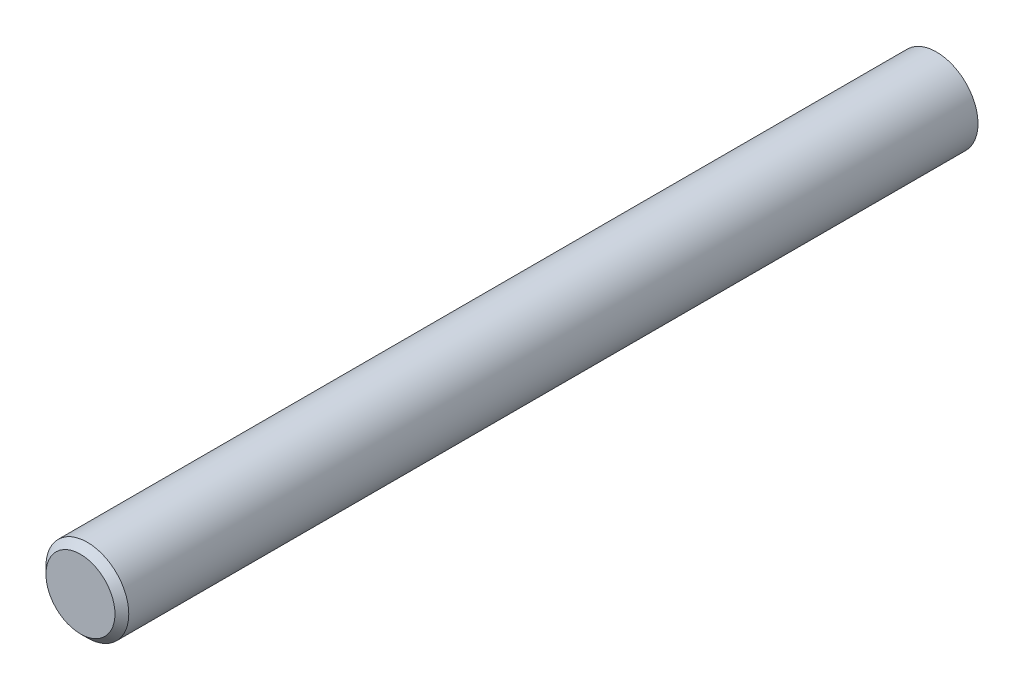
ISO-10303-21;
HEADER;
FILE_DESCRIPTION(('STEP AP214'),'2;1');
FILE_NAME('part.step','',(''),(''),'','','');
FILE_SCHEMA(('AUTOMOTIVE_DESIGN { 1 0 10303 214 1 1 1 1 }'));
ENDSEC;
DATA;
#1=APPLICATION_CONTEXT('core data for automotive mechanical design processes');
#2=APPLICATION_PROTOCOL_DEFINITION('international standard','automotive_design',2000,#1);
#3=PRODUCT_CONTEXT('',#1,'mechanical');
#4=PRODUCT('Part','Part','',(#3));
#5=PRODUCT_RELATED_PRODUCT_CATEGORY('part','',(#4));
#6=PRODUCT_DEFINITION_FORMATION('','',#4);
#7=PRODUCT_DEFINITION_CONTEXT('part definition',#1,'design');
#8=PRODUCT_DEFINITION('design','',#6,#7);
#9=PRODUCT_DEFINITION_SHAPE('','',#8);
#10=(LENGTH_UNIT() NAMED_UNIT(*) SI_UNIT(.MILLI.,.METRE.));
#11=(NAMED_UNIT(*) PLANE_ANGLE_UNIT() SI_UNIT($,.RADIAN.));
#12=(NAMED_UNIT(*) SI_UNIT($,.STERADIAN.) SOLID_ANGLE_UNIT());
#13=UNCERTAINTY_MEASURE_WITH_UNIT(LENGTH_MEASURE(1.E-05),#10,'distance_accuracy_value','');
#14=(GEOMETRIC_REPRESENTATION_CONTEXT(3) GLOBAL_UNCERTAINTY_ASSIGNED_CONTEXT((#13)) GLOBAL_UNIT_ASSIGNED_CONTEXT((#10,
#11,#12)) REPRESENTATION_CONTEXT('',''));
#15=CARTESIAN_POINT('',(0.,0.,0.));
#16=DIRECTION('',(0.,0.,1.));
#17=DIRECTION('',(1.,0.,0.));
#18=AXIS2_PLACEMENT_3D('',#15,#16,#17);
#19=CARTESIAN_POINT('',(0.,0.,124.));
#20=DIRECTION('',(0.,0.,-1.));
#21=DIRECTION('',(-1.,0.,0.));
#22=AXIS2_PLACEMENT_3D('',#19,#20,#21);
#23=CYLINDRICAL_SURFACE('',#22,6.);
#24=CARTESIAN_POINT('',(0.,0.,123.));
#25=DIRECTION('',(0.,0.,1.));
#26=DIRECTION('',(1.,0.,0.));
#27=AXIS2_PLACEMENT_3D('',#24,#25,#26);
#28=CIRCLE('',#27,6.);
#29=CARTESIAN_POINT('',(6.,0.,123.));
#30=VERTEX_POINT('',#29);
#31=EDGE_CURVE('E10',#30,#30,#28,.F.);
#32=ORIENTED_EDGE('',*,*,#31,.T.);
#33=EDGE_LOOP('',(#32));
#34=FACE_BOUND('',#33,.T.);
#35=CARTESIAN_POINT('',(0.,0.,0.));
#36=DIRECTION('',(0.,0.,1.));
#37=DIRECTION('',(1.,0.,0.));
#38=AXIS2_PLACEMENT_3D('',#35,#36,#37);
#39=CIRCLE('',#38,6.);
#40=CARTESIAN_POINT('',(6.,0.,0.));
#41=VERTEX_POINT('',#40);
#42=EDGE_CURVE('E42',#41,#41,#39,.T.);
#43=ORIENTED_EDGE('',*,*,#42,.T.);
#44=EDGE_LOOP('',(#43));
#45=FACE_BOUND('',#44,.T.);
#46=ADVANCED_FACE('F31',(#34,#45),#23,.T.);
#47=CARTESIAN_POINT('',(0.,0.,124.));
#48=DIRECTION('',(0.,0.,1.));
#49=DIRECTION('',(1.,0.,0.));
#50=AXIS2_PLACEMENT_3D('',#47,#48,#49);
#51=PLANE('',#50);
#52=CARTESIAN_POINT('',(0.,0.,124.));
#53=DIRECTION('',(0.,0.,1.));
#54=DIRECTION('',(1.,0.,0.));
#55=AXIS2_PLACEMENT_3D('',#52,#53,#54);
#56=CIRCLE('',#55,4.99999999999999);
#57=CARTESIAN_POINT('',(4.99999999999999,0.,124.));
#58=VERTEX_POINT('',#57);
#59=EDGE_CURVE('E38',#58,#58,#56,.T.);
#60=ORIENTED_EDGE('',*,*,#59,.T.);
#61=EDGE_LOOP('',(#60));
#62=FACE_BOUND('',#61,.T.);
#63=ADVANCED_FACE('F52',(#62),#51,.T.);
#64=CARTESIAN_POINT('',(0.,0.,0.));
#65=DIRECTION('',(0.,0.,1.));
#66=DIRECTION('',(1.,0.,0.));
#67=AXIS2_PLACEMENT_3D('',#64,#65,#66);
#68=PLANE('',#67);
#69=ORIENTED_EDGE('',*,*,#42,.F.);
#70=EDGE_LOOP('',(#69));
#71=FACE_BOUND('',#70,.T.);
#72=ADVANCED_FACE('F50',(#71),#68,.F.);
#73=CARTESIAN_POINT('',(0.,0.,124.));
#74=DIRECTION('',(0.,0.,-1.));
#75=DIRECTION('',(-1.,0.,0.));
#76=AXIS2_PLACEMENT_3D('',#73,#74,#75);
#77=CONICAL_SURFACE('',#76,4.99999999999999,0.785398163397453);
#78=ORIENTED_EDGE('',*,*,#31,.F.);
#79=EDGE_LOOP('',(#78));
#80=FACE_BOUND('',#79,.T.);
#81=ORIENTED_EDGE('',*,*,#59,.F.);
#82=EDGE_LOOP('',(#81));
#83=FACE_BOUND('',#82,.T.);
#84=ADVANCED_FACE('F33',(#80,#83),#77,.T.);
#85=CLOSED_SHELL('',(#46,#63,#72,#84));
#86=MANIFOLD_SOLID_BREP('B2',#85);
#87=ADVANCED_BREP_SHAPE_REPRESENTATION('',(#18,#86),#14);
#88=SHAPE_DEFINITION_REPRESENTATION(#9,#87);
ENDSEC;
END-ISO-10303-21;
